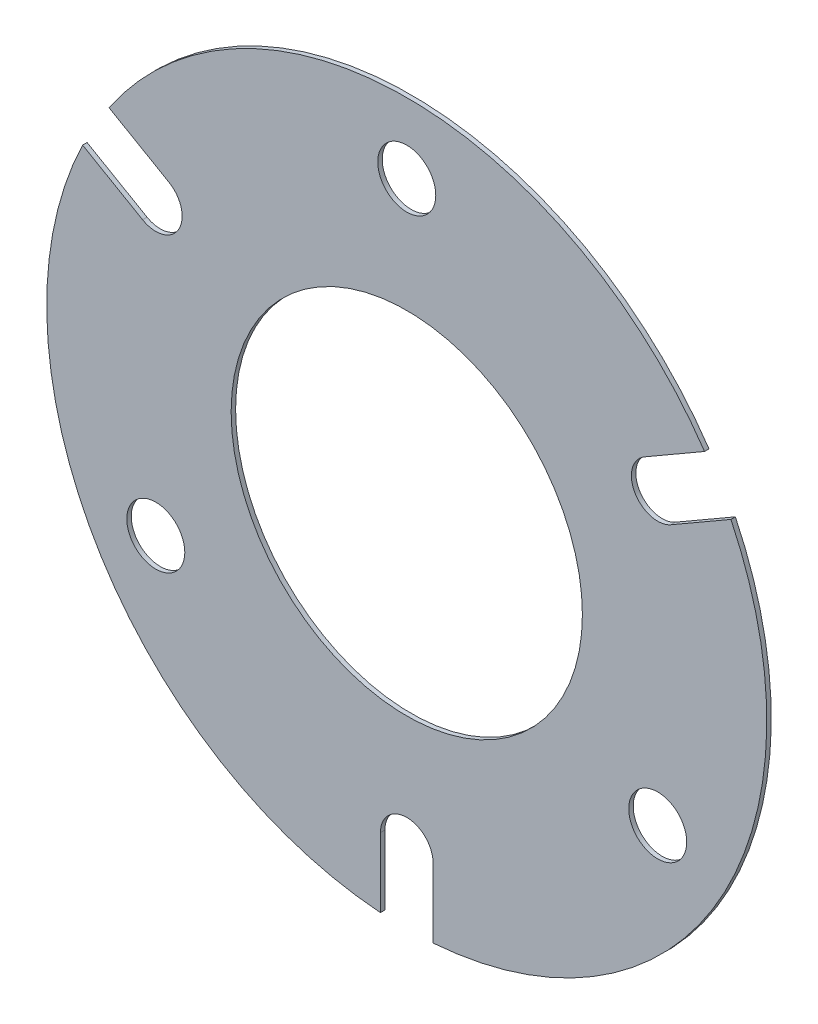
ISO-10303-21;
HEADER;
FILE_DESCRIPTION(('STEP AP214'),'2;1');
FILE_NAME('part.step','',(''),(''),'','','');
FILE_SCHEMA(('AUTOMOTIVE_DESIGN { 1 0 10303 214 1 1 1 1 }'));
ENDSEC;
DATA;
#1=APPLICATION_CONTEXT('core data for automotive mechanical design processes');
#2=APPLICATION_PROTOCOL_DEFINITION('international standard','automotive_design',2000,#1);
#3=PRODUCT_CONTEXT('',#1,'mechanical');
#4=PRODUCT('Part','Part','',(#3));
#5=PRODUCT_RELATED_PRODUCT_CATEGORY('part','',(#4));
#6=PRODUCT_DEFINITION_FORMATION('','',#4);
#7=PRODUCT_DEFINITION_CONTEXT('part definition',#1,'design');
#8=PRODUCT_DEFINITION('design','',#6,#7);
#9=PRODUCT_DEFINITION_SHAPE('','',#8);
#10=(LENGTH_UNIT() NAMED_UNIT(*) SI_UNIT(.MILLI.,.METRE.));
#11=(NAMED_UNIT(*) PLANE_ANGLE_UNIT() SI_UNIT($,.RADIAN.));
#12=(NAMED_UNIT(*) SI_UNIT($,.STERADIAN.) SOLID_ANGLE_UNIT());
#13=UNCERTAINTY_MEASURE_WITH_UNIT(LENGTH_MEASURE(1.E-05),#10,'distance_accuracy_value','');
#14=(GEOMETRIC_REPRESENTATION_CONTEXT(3) GLOBAL_UNCERTAINTY_ASSIGNED_CONTEXT((#13)) GLOBAL_UNIT_ASSIGNED_CONTEXT((#10,
#11,#12)) REPRESENTATION_CONTEXT('',''));
#15=CARTESIAN_POINT('',(0.,0.,0.));
#16=DIRECTION('',(0.,0.,1.));
#17=DIRECTION('',(1.,0.,0.));
#18=AXIS2_PLACEMENT_3D('',#15,#16,#17);
#19=CARTESIAN_POINT('',(0.,0.,0.254));
#20=DIRECTION('',(0.,0.,1.));
#21=DIRECTION('',(1.,0.,0.));
#22=AXIS2_PLACEMENT_3D('',#19,#20,#21);
#23=PLANE('',#22);
#24=CARTESIAN_POINT('',(-14.2894191624432,-8.25,0.254));
#25=DIRECTION('',(0.,0.,1.));
#26=DIRECTION('',(1.,0.,0.));
#27=AXIS2_PLACEMENT_3D('',#24,#25,#26);
#28=CIRCLE('',#27,1.651);
#29=CARTESIAN_POINT('',(-12.6384191624432,-8.25,0.254));
#30=VERTEX_POINT('',#29);
#31=EDGE_CURVE('E211',#30,#30,#28,.T.);
#32=ORIENTED_EDGE('',*,*,#31,.F.);
#33=EDGE_LOOP('',(#32));
#34=FACE_BOUND('',#33,.T.);
#35=CARTESIAN_POINT('',(0.,16.5,0.254));
#36=DIRECTION('',(0.,0.,1.));
#37=DIRECTION('',(1.,0.,0.));
#38=AXIS2_PLACEMENT_3D('',#35,#36,#37);
#39=CIRCLE('',#38,1.651);
#40=CARTESIAN_POINT('',(1.651,16.5,0.254));
#41=VERTEX_POINT('',#40);
#42=EDGE_CURVE('E223',#41,#41,#39,.T.);
#43=ORIENTED_EDGE('',*,*,#42,.F.);
#44=EDGE_LOOP('',(#43));
#45=FACE_BOUND('',#44,.T.);
#46=CARTESIAN_POINT('',(0.,0.,0.254));
#47=DIRECTION('',(0.,0.,1.));
#48=DIRECTION('',(1.,0.,0.));
#49=AXIS2_PLACEMENT_3D('',#46,#47,#48);
#50=CIRCLE('',#49,10.);
#51=CARTESIAN_POINT('',(10.,0.,0.254));
#52=VERTEX_POINT('',#51);
#53=EDGE_CURVE('E229',#52,#52,#50,.T.);
#54=ORIENTED_EDGE('',*,*,#53,.F.);
#55=EDGE_LOOP('',(#54));
#56=FACE_BOUND('',#55,.T.);
#57=CARTESIAN_POINT('',(14.2894191624432,-8.25,0.254));
#58=DIRECTION('',(0.,0.,1.));
#59=DIRECTION('',(1.,0.,0.));
#60=AXIS2_PLACEMENT_3D('',#57,#58,#59);
#61=CIRCLE('',#60,1.651);
#62=CARTESIAN_POINT('',(15.9404191624432,-8.25,0.254));
#63=VERTEX_POINT('',#62);
#64=EDGE_CURVE('E217',#63,#63,#61,.T.);
#65=ORIENTED_EDGE('',*,*,#64,.F.);
#66=EDGE_LOOP('',(#65));
#67=FACE_BOUND('',#66,.T.);
#68=CARTESIAN_POINT('',(0.,0.,0.254));
#69=DIRECTION('',(0.,0.,1.));
#70=DIRECTION('',(1.,0.,0.));
#71=AXIS2_PLACEMENT_3D('',#68,#69,#70);
#72=CIRCLE('',#71,20.5);
#73=CARTESIAN_POINT('',(1.5,-20.4450483002609,0.254));
#74=VERTEX_POINT('',#73);
#75=CARTESIAN_POINT('',(18.4559312096259,8.92348604445361,0.254));
#76=VERTEX_POINT('',#75);
#77=EDGE_CURVE('E11',#74,#76,#72,.T.);
#78=ORIENTED_EDGE('',*,*,#77,.T.);
#79=DIRECTION('',(0.866025403784443,0.499999999999992,0.));
#80=VECTOR('',#79,1.);
#81=CARTESIAN_POINT('',(0.749999999999984,-1.29903810567667,0.254));
#82=LINE('',#81,#80);
#83=CARTESIAN_POINT('',(15.0394191624433,6.9509618943232,0.254));
#84=VERTEX_POINT('',#83);
#85=EDGE_CURVE('E128',#84,#76,#82,.T.);
#86=ORIENTED_EDGE('',*,*,#85,.F.);
#87=CARTESIAN_POINT('',(14.2894191624433,8.24999999999987,0.254));
#88=DIRECTION('',(0.,0.,-1.));
#89=DIRECTION('',(0.499999999999992,-0.866025403784443,0.));
#90=AXIS2_PLACEMENT_3D('',#87,#88,#89);
#91=CIRCLE('',#90,1.5);
#92=CARTESIAN_POINT('',(13.5394191624433,9.54903810567653,0.254));
#93=VERTEX_POINT('',#92);
#94=EDGE_CURVE('E139',#84,#93,#91,.T.);
#95=ORIENTED_EDGE('',*,*,#94,.T.);
#96=DIRECTION('',(0.866025403784443,0.499999999999992,0.));
#97=VECTOR('',#96,1.);
#98=CARTESIAN_POINT('',(-0.749999999999993,1.29903810567666,0.254));
#99=LINE('',#98,#97);
#100=CARTESIAN_POINT('',(16.9559312096259,11.5215622558069,0.254));
#101=VERTEX_POINT('',#100);
#102=EDGE_CURVE('E136',#93,#101,#99,.T.);
#103=ORIENTED_EDGE('',*,*,#102,.T.);
#104=CARTESIAN_POINT('',(-16.9559312096257,11.5215622558072,0.254));
#105=VERTEX_POINT('',#104);
#106=EDGE_CURVE('E43',#101,#105,#72,.T.);
#107=ORIENTED_EDGE('',*,*,#106,.T.);
#108=DIRECTION('',(-0.866025403784436,0.500000000000004,0.));
#109=VECTOR('',#108,1.);
#110=CARTESIAN_POINT('',(0.750000000000011,1.29903810567665,0.254));
#111=LINE('',#110,#109);
#112=CARTESIAN_POINT('',(-13.5394191624432,9.54903810567672,0.254));
#113=VERTEX_POINT('',#112);
#114=EDGE_CURVE('E160',#113,#105,#111,.T.);
#115=ORIENTED_EDGE('',*,*,#114,.F.);
#116=CARTESIAN_POINT('',(-14.2894191624432,8.25000000000007,0.254));
#117=DIRECTION('',(0.,0.,-1.));
#118=DIRECTION('',(0.500000000000004,0.866025403784436,0.));
#119=AXIS2_PLACEMENT_3D('',#116,#117,#118);
#120=CIRCLE('',#119,1.5);
#121=CARTESIAN_POINT('',(-15.0394191624432,6.95096189432341,0.254));
#122=VERTEX_POINT('',#121);
#123=EDGE_CURVE('E163',#113,#122,#120,.T.);
#124=ORIENTED_EDGE('',*,*,#123,.T.);
#125=DIRECTION('',(-0.866025403784436,0.500000000000004,0.));
#126=VECTOR('',#125,1.);
#127=CARTESIAN_POINT('',(-0.750000000000002,-1.29903810567666,0.254));
#128=LINE('',#127,#126);
#129=CARTESIAN_POINT('',(-18.4559312096257,8.92348604445386,0.254));
#130=VERTEX_POINT('',#129);
#131=EDGE_CURVE('E166',#122,#130,#128,.T.);
#132=ORIENTED_EDGE('',*,*,#131,.T.);
#133=CARTESIAN_POINT('',(-1.5,-20.4450483002609,0.254));
#134=VERTEX_POINT('',#133);
#135=EDGE_CURVE('E44',#130,#134,#72,.T.);
#136=ORIENTED_EDGE('',*,*,#135,.T.);
#137=DIRECTION('',(0.,-1.,0.));
#138=VECTOR('',#137,1.);
#139=CARTESIAN_POINT('',(-1.5,0.,0.254));
#140=LINE('',#139,#138);
#141=CARTESIAN_POINT('',(-1.5,-16.5,0.254));
#142=VERTEX_POINT('',#141);
#143=EDGE_CURVE('E185',#142,#134,#140,.T.);
#144=ORIENTED_EDGE('',*,*,#143,.F.);
#145=CARTESIAN_POINT('',(0.,-16.5,0.254));
#146=DIRECTION('',(0.,0.,-1.));
#147=DIRECTION('',(-1.,0.,0.));
#148=AXIS2_PLACEMENT_3D('',#145,#146,#147);
#149=CIRCLE('',#148,1.5);
#150=CARTESIAN_POINT('',(1.5,-16.5,0.254));
#151=VERTEX_POINT('',#150);
#152=EDGE_CURVE('E188',#142,#151,#149,.T.);
#153=ORIENTED_EDGE('',*,*,#152,.T.);
#154=DIRECTION('',(0.,-1.,0.));
#155=VECTOR('',#154,1.);
#156=CARTESIAN_POINT('',(1.5,0.,0.254));
#157=LINE('',#156,#155);
#158=EDGE_CURVE('E192',#151,#74,#157,.T.);
#159=ORIENTED_EDGE('',*,*,#158,.T.);
#160=EDGE_LOOP('',(#78,#86,#95,#103,#107,#115,#124,#132,#136,#144,#153,#159));
#161=FACE_BOUND('',#160,.T.);
#162=ADVANCED_FACE('F34',(#34,#45,#56,#67,#161),#23,.T.);
#163=CARTESIAN_POINT('',(0.,0.,0.));
#164=DIRECTION('',(0.,0.,1.));
#165=DIRECTION('',(1.,0.,0.));
#166=AXIS2_PLACEMENT_3D('',#163,#164,#165);
#167=PLANE('',#166);
#168=CARTESIAN_POINT('',(-14.2894191624432,-8.25,0.));
#169=DIRECTION('',(0.,0.,1.));
#170=DIRECTION('',(1.,0.,0.));
#171=AXIS2_PLACEMENT_3D('',#168,#169,#170);
#172=CIRCLE('',#171,1.651);
#173=CARTESIAN_POINT('',(-12.6384191624432,-8.25,0.));
#174=VERTEX_POINT('',#173);
#175=EDGE_CURVE('E204',#174,#174,#172,.T.);
#176=ORIENTED_EDGE('',*,*,#175,.T.);
#177=EDGE_LOOP('',(#176));
#178=FACE_BOUND('',#177,.T.);
#179=CARTESIAN_POINT('',(0.,16.5,0.));
#180=DIRECTION('',(0.,0.,1.));
#181=DIRECTION('',(1.,0.,0.));
#182=AXIS2_PLACEMENT_3D('',#179,#180,#181);
#183=CIRCLE('',#182,1.651);
#184=CARTESIAN_POINT('',(1.651,16.5,0.));
#185=VERTEX_POINT('',#184);
#186=EDGE_CURVE('E220',#185,#185,#183,.T.);
#187=ORIENTED_EDGE('',*,*,#186,.T.);
#188=EDGE_LOOP('',(#187));
#189=FACE_BOUND('',#188,.T.);
#190=CARTESIAN_POINT('',(0.,0.,0.));
#191=DIRECTION('',(0.,0.,1.));
#192=DIRECTION('',(1.,0.,0.));
#193=AXIS2_PLACEMENT_3D('',#190,#191,#192);
#194=CIRCLE('',#193,10.);
#195=CARTESIAN_POINT('',(10.,0.,0.));
#196=VERTEX_POINT('',#195);
#197=EDGE_CURVE('E226',#196,#196,#194,.T.);
#198=ORIENTED_EDGE('',*,*,#197,.T.);
#199=EDGE_LOOP('',(#198));
#200=FACE_BOUND('',#199,.T.);
#201=CARTESIAN_POINT('',(14.2894191624432,-8.25,0.));
#202=DIRECTION('',(0.,0.,1.));
#203=DIRECTION('',(1.,0.,0.));
#204=AXIS2_PLACEMENT_3D('',#201,#202,#203);
#205=CIRCLE('',#204,1.651);
#206=CARTESIAN_POINT('',(15.9404191624432,-8.25,0.));
#207=VERTEX_POINT('',#206);
#208=EDGE_CURVE('E214',#207,#207,#205,.T.);
#209=ORIENTED_EDGE('',*,*,#208,.T.);
#210=EDGE_LOOP('',(#209));
#211=FACE_BOUND('',#210,.T.);
#212=DIRECTION('',(0.866025403784443,0.499999999999992,0.));
#213=VECTOR('',#212,1.);
#214=CARTESIAN_POINT('',(0.749999999999984,-1.29903810567667,0.));
#215=LINE('',#214,#213);
#216=CARTESIAN_POINT('',(15.0394191624433,6.9509618943232,0.));
#217=VERTEX_POINT('',#216);
#218=CARTESIAN_POINT('',(18.4559312096259,8.92348604445361,0.));
#219=VERTEX_POINT('',#218);
#220=EDGE_CURVE('E131',#217,#219,#215,.T.);
#221=ORIENTED_EDGE('',*,*,#220,.T.);
#222=CARTESIAN_POINT('',(0.,0.,0.));
#223=DIRECTION('',(0.,0.,1.));
#224=DIRECTION('',(1.,0.,0.));
#225=AXIS2_PLACEMENT_3D('',#222,#223,#224);
#226=CIRCLE('',#225,20.5);
#227=CARTESIAN_POINT('',(1.5,-20.4450483002609,0.));
#228=VERTEX_POINT('',#227);
#229=EDGE_CURVE('E38',#228,#219,#226,.T.);
#230=ORIENTED_EDGE('',*,*,#229,.F.);
#231=DIRECTION('',(0.,-1.,0.));
#232=VECTOR('',#231,1.);
#233=CARTESIAN_POINT('',(1.5,0.,0.));
#234=LINE('',#233,#232);
#235=CARTESIAN_POINT('',(1.5,-16.5,0.));
#236=VERTEX_POINT('',#235);
#237=EDGE_CURVE('E189',#236,#228,#234,.T.);
#238=ORIENTED_EDGE('',*,*,#237,.F.);
#239=CARTESIAN_POINT('',(0.,-16.5,0.));
#240=DIRECTION('',(0.,0.,-1.));
#241=DIRECTION('',(-1.,0.,0.));
#242=AXIS2_PLACEMENT_3D('',#239,#240,#241);
#243=CIRCLE('',#242,1.5);
#244=CARTESIAN_POINT('',(-1.5,-16.5,0.));
#245=VERTEX_POINT('',#244);
#246=EDGE_CURVE('E197',#245,#236,#243,.T.);
#247=ORIENTED_EDGE('',*,*,#246,.F.);
#248=DIRECTION('',(0.,-1.,0.));
#249=VECTOR('',#248,1.);
#250=CARTESIAN_POINT('',(-1.5,0.,0.));
#251=LINE('',#250,#249);
#252=CARTESIAN_POINT('',(-1.5,-20.4450483002609,0.));
#253=VERTEX_POINT('',#252);
#254=EDGE_CURVE('E179',#245,#253,#251,.T.);
#255=ORIENTED_EDGE('',*,*,#254,.T.);
#256=CARTESIAN_POINT('',(-18.4559312096257,8.92348604445386,0.));
#257=VERTEX_POINT('',#256);
#258=EDGE_CURVE('E232',#257,#253,#226,.T.);
#259=ORIENTED_EDGE('',*,*,#258,.F.);
#260=DIRECTION('',(-0.866025403784436,0.500000000000004,0.));
#261=VECTOR('',#260,1.);
#262=CARTESIAN_POINT('',(-0.750000000000002,-1.29903810567666,0.));
#263=LINE('',#262,#261);
#264=CARTESIAN_POINT('',(-15.0394191624432,6.95096189432341,0.));
#265=VERTEX_POINT('',#264);
#266=EDGE_CURVE('E59',#265,#257,#263,.T.);
#267=ORIENTED_EDGE('',*,*,#266,.F.);
#268=CARTESIAN_POINT('',(-14.2894191624432,8.25000000000007,0.));
#269=DIRECTION('',(0.,0.,-1.));
#270=DIRECTION('',(0.500000000000004,0.866025403784436,0.));
#271=AXIS2_PLACEMENT_3D('',#268,#269,#270);
#272=CIRCLE('',#271,1.5);
#273=CARTESIAN_POINT('',(-13.5394191624432,9.54903810567672,0.));
#274=VERTEX_POINT('',#273);
#275=EDGE_CURVE('E172',#274,#265,#272,.T.);
#276=ORIENTED_EDGE('',*,*,#275,.F.);
#277=DIRECTION('',(-0.866025403784436,0.500000000000004,0.));
#278=VECTOR('',#277,1.);
#279=CARTESIAN_POINT('',(0.750000000000011,1.29903810567665,0.));
#280=LINE('',#279,#278);
#281=CARTESIAN_POINT('',(-16.9559312096257,11.5215622558072,0.));
#282=VERTEX_POINT('',#281);
#283=EDGE_CURVE('E156',#274,#282,#280,.T.);
#284=ORIENTED_EDGE('',*,*,#283,.T.);
#285=CARTESIAN_POINT('',(16.9559312096259,11.5215622558069,0.));
#286=VERTEX_POINT('',#285);
#287=EDGE_CURVE('E279',#286,#282,#226,.T.);
#288=ORIENTED_EDGE('',*,*,#287,.F.);
#289=DIRECTION('',(0.866025403784443,0.499999999999992,0.));
#290=VECTOR('',#289,1.);
#291=CARTESIAN_POINT('',(-0.749999999999993,1.29903810567666,0.));
#292=LINE('',#291,#290);
#293=CARTESIAN_POINT('',(13.5394191624433,9.54903810567653,0.));
#294=VERTEX_POINT('',#293);
#295=EDGE_CURVE('E51',#294,#286,#292,.T.);
#296=ORIENTED_EDGE('',*,*,#295,.F.);
#297=CARTESIAN_POINT('',(14.2894191624433,8.24999999999987,0.));
#298=DIRECTION('',(0.,0.,-1.));
#299=DIRECTION('',(0.499999999999992,-0.866025403784443,0.));
#300=AXIS2_PLACEMENT_3D('',#297,#298,#299);
#301=CIRCLE('',#300,1.5);
#302=EDGE_CURVE('E148',#217,#294,#301,.T.);
#303=ORIENTED_EDGE('',*,*,#302,.F.);
#304=EDGE_LOOP('',(#221,#230,#238,#247,#255,#259,#267,#276,#284,#288,#296,#303));
#305=FACE_BOUND('',#304,.T.);
#306=ADVANCED_FACE('F236',(#178,#189,#200,#211,#305),#167,.F.);
#307=CARTESIAN_POINT('',(0.,0.,0.254));
#308=DIRECTION('',(0.,0.,-1.));
#309=DIRECTION('',(-1.,0.,0.));
#310=AXIS2_PLACEMENT_3D('',#307,#308,#309);
#311=CYLINDRICAL_SURFACE('',#310,20.5);
#312=DIRECTION('',(0.,0.,-1.));
#313=VECTOR('',#312,1.);
#314=CARTESIAN_POINT('',(18.4559312096259,8.92348604445361,0.254));
#315=LINE('',#314,#313);
#316=EDGE_CURVE('E154',#76,#219,#315,.T.);
#317=ORIENTED_EDGE('',*,*,#316,.F.);
#318=ORIENTED_EDGE('',*,*,#77,.F.);
#319=DIRECTION('',(0.,0.,-1.));
#320=VECTOR('',#319,1.);
#321=CARTESIAN_POINT('',(1.5,-20.4450483002609,0.254));
#322=LINE('',#321,#320);
#323=EDGE_CURVE('E205',#74,#228,#322,.T.);
#324=ORIENTED_EDGE('',*,*,#323,.T.);
#325=ORIENTED_EDGE('',*,*,#229,.T.);
#326=EDGE_LOOP('',(#317,#318,#324,#325));
#327=FACE_BOUND('',#326,.T.);
#328=ADVANCED_FACE('F253',(#327),#311,.T.);
#329=ORIENTED_EDGE('',*,*,#106,.F.);
#330=DIRECTION('',(0.,0.,-1.));
#331=VECTOR('',#330,1.);
#332=CARTESIAN_POINT('',(16.9559312096259,11.5215622558069,0.254));
#333=LINE('',#332,#331);
#334=EDGE_CURVE('E157',#101,#286,#333,.T.);
#335=ORIENTED_EDGE('',*,*,#334,.T.);
#336=ORIENTED_EDGE('',*,*,#287,.T.);
#337=DIRECTION('',(0.,0.,-1.));
#338=VECTOR('',#337,1.);
#339=CARTESIAN_POINT('',(-16.9559312096257,11.5215622558072,0.254));
#340=LINE('',#339,#338);
#341=EDGE_CURVE('E176',#105,#282,#340,.T.);
#342=ORIENTED_EDGE('',*,*,#341,.F.);
#343=EDGE_LOOP('',(#329,#335,#336,#342));
#344=FACE_BOUND('',#343,.T.);
#345=ADVANCED_FACE('F251',(#344),#311,.T.);
#346=ORIENTED_EDGE('',*,*,#135,.F.);
#347=DIRECTION('',(0.,0.,-1.));
#348=VECTOR('',#347,1.);
#349=CARTESIAN_POINT('',(-18.4559312096257,8.92348604445386,0.254));
#350=LINE('',#349,#348);
#351=EDGE_CURVE('E180',#130,#257,#350,.T.);
#352=ORIENTED_EDGE('',*,*,#351,.T.);
#353=ORIENTED_EDGE('',*,*,#258,.T.);
#354=DIRECTION('',(0.,0.,-1.));
#355=VECTOR('',#354,1.);
#356=CARTESIAN_POINT('',(-1.5,-20.4450483002609,0.254));
#357=LINE('',#356,#355);
#358=EDGE_CURVE('E201',#134,#253,#357,.T.);
#359=ORIENTED_EDGE('',*,*,#358,.F.);
#360=EDGE_LOOP('',(#346,#352,#353,#359));
#361=FACE_BOUND('',#360,.T.);
#362=ADVANCED_FACE('F36',(#361),#311,.T.);
#363=CARTESIAN_POINT('',(0.,0.,0.254));
#364=DIRECTION('',(0.,0.,-1.));
#365=DIRECTION('',(-1.,0.,0.));
#366=AXIS2_PLACEMENT_3D('',#363,#364,#365);
#367=CYLINDRICAL_SURFACE('',#366,10.);
#368=ORIENTED_EDGE('',*,*,#53,.T.);
#369=EDGE_LOOP('',(#368));
#370=FACE_BOUND('',#369,.T.);
#371=ORIENTED_EDGE('',*,*,#197,.F.);
#372=EDGE_LOOP('',(#371));
#373=FACE_BOUND('',#372,.T.);
#374=ADVANCED_FACE('F239',(#370,#373),#367,.F.);
#375=CARTESIAN_POINT('',(0.,16.5,0.254));
#376=DIRECTION('',(0.,0.,-1.));
#377=DIRECTION('',(-1.,0.,0.));
#378=AXIS2_PLACEMENT_3D('',#375,#376,#377);
#379=CYLINDRICAL_SURFACE('',#378,1.651);
#380=ORIENTED_EDGE('',*,*,#42,.T.);
#381=EDGE_LOOP('',(#380));
#382=FACE_BOUND('',#381,.T.);
#383=ORIENTED_EDGE('',*,*,#186,.F.);
#384=EDGE_LOOP('',(#383));
#385=FACE_BOUND('',#384,.T.);
#386=ADVANCED_FACE('F241',(#382,#385),#379,.F.);
#387=CARTESIAN_POINT('',(14.2894191624432,-8.25,0.254));
#388=DIRECTION('',(0.,0.,-1.));
#389=DIRECTION('',(-1.,0.,0.));
#390=AXIS2_PLACEMENT_3D('',#387,#388,#389);
#391=CYLINDRICAL_SURFACE('',#390,1.651);
#392=ORIENTED_EDGE('',*,*,#64,.T.);
#393=EDGE_LOOP('',(#392));
#394=FACE_BOUND('',#393,.T.);
#395=ORIENTED_EDGE('',*,*,#208,.F.);
#396=EDGE_LOOP('',(#395));
#397=FACE_BOUND('',#396,.T.);
#398=ADVANCED_FACE('F248',(#394,#397),#391,.F.);
#399=CARTESIAN_POINT('',(-14.2894191624432,-8.25,0.254));
#400=DIRECTION('',(0.,0.,-1.));
#401=DIRECTION('',(-1.,0.,0.));
#402=AXIS2_PLACEMENT_3D('',#399,#400,#401);
#403=CYLINDRICAL_SURFACE('',#402,1.651);
#404=ORIENTED_EDGE('',*,*,#31,.T.);
#405=EDGE_LOOP('',(#404));
#406=FACE_BOUND('',#405,.T.);
#407=ORIENTED_EDGE('',*,*,#175,.F.);
#408=EDGE_LOOP('',(#407));
#409=FACE_BOUND('',#408,.T.);
#410=ADVANCED_FACE('F271',(#406,#409),#403,.F.);
#411=CARTESIAN_POINT('',(-1.5,0.,0.254));
#412=DIRECTION('',(1.,0.,0.));
#413=DIRECTION('',(0.,0.,-1.));
#414=AXIS2_PLACEMENT_3D('',#411,#412,#413);
#415=PLANE('',#414);
#416=ORIENTED_EDGE('',*,*,#254,.F.);
#417=DIRECTION('',(0.,0.,-1.));
#418=VECTOR('',#417,1.);
#419=CARTESIAN_POINT('',(-1.5,-16.5,0.254));
#420=LINE('',#419,#418);
#421=EDGE_CURVE('E194',#142,#245,#420,.T.);
#422=ORIENTED_EDGE('',*,*,#421,.F.);
#423=ORIENTED_EDGE('',*,*,#143,.T.);
#424=ORIENTED_EDGE('',*,*,#358,.T.);
#425=EDGE_LOOP('',(#416,#422,#423,#424));
#426=FACE_BOUND('',#425,.T.);
#427=ADVANCED_FACE('F285',(#426),#415,.T.);
#428=CARTESIAN_POINT('',(1.5,0.,0.254));
#429=DIRECTION('',(1.,0.,0.));
#430=DIRECTION('',(0.,0.,-1.));
#431=AXIS2_PLACEMENT_3D('',#428,#429,#430);
#432=PLANE('',#431);
#433=ORIENTED_EDGE('',*,*,#237,.T.);
#434=ORIENTED_EDGE('',*,*,#323,.F.);
#435=ORIENTED_EDGE('',*,*,#158,.F.);
#436=DIRECTION('',(0.,0.,-1.));
#437=VECTOR('',#436,1.);
#438=CARTESIAN_POINT('',(1.5,-16.5,0.254));
#439=LINE('',#438,#437);
#440=EDGE_CURVE('E208',#151,#236,#439,.T.);
#441=ORIENTED_EDGE('',*,*,#440,.T.);
#442=EDGE_LOOP('',(#433,#434,#435,#441));
#443=FACE_BOUND('',#442,.T.);
#444=ADVANCED_FACE('F322',(#443),#432,.F.);
#445=CARTESIAN_POINT('',(0.,-16.5,0.254));
#446=DIRECTION('',(0.,0.,-1.));
#447=DIRECTION('',(-1.,0.,0.));
#448=AXIS2_PLACEMENT_3D('',#445,#446,#447);
#449=CYLINDRICAL_SURFACE('',#448,1.5);
#450=ORIENTED_EDGE('',*,*,#246,.T.);
#451=ORIENTED_EDGE('',*,*,#440,.F.);
#452=ORIENTED_EDGE('',*,*,#152,.F.);
#453=ORIENTED_EDGE('',*,*,#421,.T.);
#454=EDGE_LOOP('',(#450,#451,#452,#453));
#455=FACE_BOUND('',#454,.T.);
#456=ADVANCED_FACE('F289',(#455),#449,.F.);
#457=CARTESIAN_POINT('',(0.750000000000011,1.29903810567665,0.254));
#458=DIRECTION('',(-0.500000000000004,-0.866025403784436,0.));
#459=DIRECTION('',(0.866025403784436,-0.500000000000004,0.));
#460=AXIS2_PLACEMENT_3D('',#457,#458,#459);
#461=PLANE('',#460);
#462=ORIENTED_EDGE('',*,*,#283,.F.);
#463=DIRECTION('',(0.,0.,-1.));
#464=VECTOR('',#463,1.);
#465=CARTESIAN_POINT('',(-13.5394191624432,9.54903810567672,0.254));
#466=LINE('',#465,#464);
#467=EDGE_CURVE('E169',#113,#274,#466,.T.);
#468=ORIENTED_EDGE('',*,*,#467,.F.);
#469=ORIENTED_EDGE('',*,*,#114,.T.);
#470=ORIENTED_EDGE('',*,*,#341,.T.);
#471=EDGE_LOOP('',(#462,#468,#469,#470));
#472=FACE_BOUND('',#471,.T.);
#473=ADVANCED_FACE('F302',(#472),#461,.T.);
#474=CARTESIAN_POINT('',(-0.750000000000002,-1.29903810567666,0.254));
#475=DIRECTION('',(-0.500000000000004,-0.866025403784436,0.));
#476=DIRECTION('',(0.866025403784436,-0.500000000000004,0.));
#477=AXIS2_PLACEMENT_3D('',#474,#475,#476);
#478=PLANE('',#477);
#479=ORIENTED_EDGE('',*,*,#266,.T.);
#480=ORIENTED_EDGE('',*,*,#351,.F.);
#481=ORIENTED_EDGE('',*,*,#131,.F.);
#482=DIRECTION('',(0.,0.,-1.));
#483=VECTOR('',#482,1.);
#484=CARTESIAN_POINT('',(-15.0394191624432,6.95096189432341,0.254));
#485=LINE('',#484,#483);
#486=EDGE_CURVE('E182',#122,#265,#485,.T.);
#487=ORIENTED_EDGE('',*,*,#486,.T.);
#488=EDGE_LOOP('',(#479,#480,#481,#487));
#489=FACE_BOUND('',#488,.T.);
#490=ADVANCED_FACE('F295',(#489),#478,.F.);
#491=CARTESIAN_POINT('',(-14.2894191624432,8.25000000000007,0.254));
#492=DIRECTION('',(0.,0.,-1.));
#493=DIRECTION('',(-1.,0.,0.));
#494=AXIS2_PLACEMENT_3D('',#491,#492,#493);
#495=CYLINDRICAL_SURFACE('',#494,1.5);
#496=ORIENTED_EDGE('',*,*,#275,.T.);
#497=ORIENTED_EDGE('',*,*,#486,.F.);
#498=ORIENTED_EDGE('',*,*,#123,.F.);
#499=ORIENTED_EDGE('',*,*,#467,.T.);
#500=EDGE_LOOP('',(#496,#497,#498,#499));
#501=FACE_BOUND('',#500,.T.);
#502=ADVANCED_FACE('F298',(#501),#495,.F.);
#503=CARTESIAN_POINT('',(0.749999999999984,-1.29903810567667,0.254));
#504=DIRECTION('',(-0.499999999999992,0.866025403784443,0.));
#505=DIRECTION('',(-0.866025403784443,-0.499999999999992,0.));
#506=AXIS2_PLACEMENT_3D('',#503,#504,#505);
#507=PLANE('',#506);
#508=ORIENTED_EDGE('',*,*,#220,.F.);
#509=DIRECTION('',(0.,0.,-1.));
#510=VECTOR('',#509,1.);
#511=CARTESIAN_POINT('',(15.0394191624433,6.9509618943232,0.254));
#512=LINE('',#511,#510);
#513=EDGE_CURVE('E124',#84,#217,#512,.T.);
#514=ORIENTED_EDGE('',*,*,#513,.F.);
#515=ORIENTED_EDGE('',*,*,#85,.T.);
#516=ORIENTED_EDGE('',*,*,#316,.T.);
#517=EDGE_LOOP('',(#508,#514,#515,#516));
#518=FACE_BOUND('',#517,.T.);
#519=ADVANCED_FACE('F126',(#518),#507,.T.);
#520=CARTESIAN_POINT('',(-0.749999999999993,1.29903810567666,0.254));
#521=DIRECTION('',(-0.499999999999992,0.866025403784443,0.));
#522=DIRECTION('',(-0.866025403784443,-0.499999999999992,0.));
#523=AXIS2_PLACEMENT_3D('',#520,#521,#522);
#524=PLANE('',#523);
#525=ORIENTED_EDGE('',*,*,#295,.T.);
#526=ORIENTED_EDGE('',*,*,#334,.F.);
#527=ORIENTED_EDGE('',*,*,#102,.F.);
#528=DIRECTION('',(0.,0.,-1.));
#529=VECTOR('',#528,1.);
#530=CARTESIAN_POINT('',(13.5394191624433,9.54903810567653,0.254));
#531=LINE('',#530,#529);
#532=EDGE_CURVE('E135',#93,#294,#531,.T.);
#533=ORIENTED_EDGE('',*,*,#532,.T.);
#534=EDGE_LOOP('',(#525,#526,#527,#533));
#535=FACE_BOUND('',#534,.T.);
#536=ADVANCED_FACE('F306',(#535),#524,.F.);
#537=CARTESIAN_POINT('',(14.2894191624433,8.24999999999987,0.254));
#538=DIRECTION('',(0.,0.,-1.));
#539=DIRECTION('',(-1.,0.,0.));
#540=AXIS2_PLACEMENT_3D('',#537,#538,#539);
#541=CYLINDRICAL_SURFACE('',#540,1.5);
#542=ORIENTED_EDGE('',*,*,#302,.T.);
#543=ORIENTED_EDGE('',*,*,#532,.F.);
#544=ORIENTED_EDGE('',*,*,#94,.F.);
#545=ORIENTED_EDGE('',*,*,#513,.T.);
#546=EDGE_LOOP('',(#542,#543,#544,#545));
#547=FACE_BOUND('',#546,.T.);
#548=ADVANCED_FACE('F140',(#547),#541,.F.);
#549=CLOSED_SHELL('',(#162,#306,#328,#345,#362,#374,#386,#398,#410,#427,#444,#456,#473,#490,
#502,#519,#536,#548));
#550=MANIFOLD_SOLID_BREP('B2',#549);
#551=ADVANCED_BREP_SHAPE_REPRESENTATION('',(#18,#550),#14);
#552=SHAPE_DEFINITION_REPRESENTATION(#9,#551);
ENDSEC;
END-ISO-10303-21;
